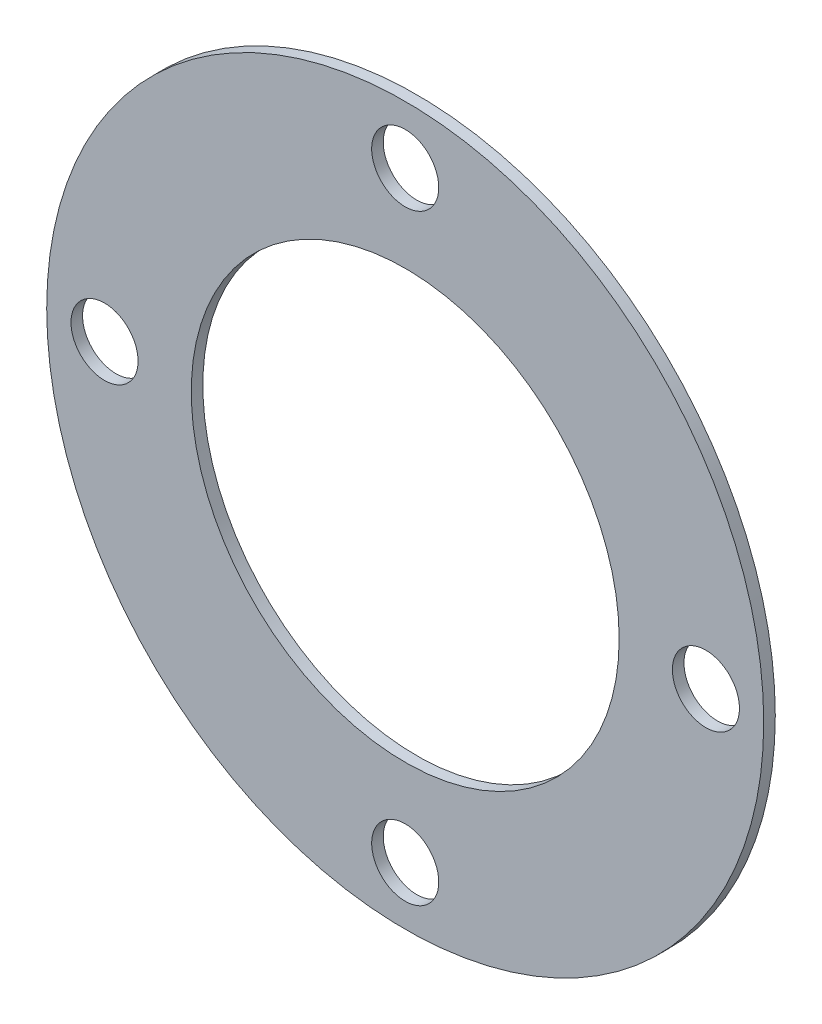
ISO-10303-21;
HEADER;
FILE_DESCRIPTION(('STEP AP214'),'2;1');
FILE_NAME('part.step','',(''),(''),'','','');
FILE_SCHEMA(('AUTOMOTIVE_DESIGN { 1 0 10303 214 1 1 1 1 }'));
ENDSEC;
DATA;
#1=APPLICATION_CONTEXT('core data for automotive mechanical design processes');
#2=APPLICATION_PROTOCOL_DEFINITION('international standard','automotive_design',2000,#1);
#3=PRODUCT_CONTEXT('',#1,'mechanical');
#4=PRODUCT('Part','Part','',(#3));
#5=PRODUCT_RELATED_PRODUCT_CATEGORY('part','',(#4));
#6=PRODUCT_DEFINITION_FORMATION('','',#4);
#7=PRODUCT_DEFINITION_CONTEXT('part definition',#1,'design');
#8=PRODUCT_DEFINITION('design','',#6,#7);
#9=PRODUCT_DEFINITION_SHAPE('','',#8);
#10=(LENGTH_UNIT() NAMED_UNIT(*) SI_UNIT(.MILLI.,.METRE.));
#11=(NAMED_UNIT(*) PLANE_ANGLE_UNIT() SI_UNIT($,.RADIAN.));
#12=(NAMED_UNIT(*) SI_UNIT($,.STERADIAN.) SOLID_ANGLE_UNIT());
#13=UNCERTAINTY_MEASURE_WITH_UNIT(LENGTH_MEASURE(1.E-05),#10,'distance_accuracy_value','');
#14=(GEOMETRIC_REPRESENTATION_CONTEXT(3) GLOBAL_UNCERTAINTY_ASSIGNED_CONTEXT((#13)) GLOBAL_UNIT_ASSIGNED_CONTEXT((#10,
#11,#12)) REPRESENTATION_CONTEXT('',''));
#15=CARTESIAN_POINT('',(0.,0.,0.));
#16=DIRECTION('',(0.,0.,1.));
#17=DIRECTION('',(1.,0.,0.));
#18=AXIS2_PLACEMENT_3D('',#15,#16,#17);
#19=CARTESIAN_POINT('',(0.,0.,1.));
#20=DIRECTION('',(0.,0.,1.));
#21=DIRECTION('',(1.,0.,0.));
#22=AXIS2_PLACEMENT_3D('',#19,#20,#21);
#23=PLANE('',#22);
#24=CARTESIAN_POINT('',(25.9999999999934,-3.34594061543591E-12,1.));
#25=DIRECTION('',(0.,0.,1.));
#26=DIRECTION('',(1.,0.,0.));
#27=AXIS2_PLACEMENT_3D('',#24,#25,#26);
#28=CIRCLE('',#27,2.9);
#29=CARTESIAN_POINT('',(28.8999999999934,-3.34594061543591E-12,1.));
#30=VERTEX_POINT('',#29);
#31=EDGE_CURVE('E73',#30,#30,#28,.T.);
#32=ORIENTED_EDGE('',*,*,#31,.F.);
#33=EDGE_LOOP('',(#32));
#34=FACE_BOUND('',#33,.T.);
#35=CARTESIAN_POINT('',(-3.36339689558326E-12,25.9999999999995,1.));
#36=DIRECTION('',(0.,0.,1.));
#37=DIRECTION('',(1.,0.,0.));
#38=AXIS2_PLACEMENT_3D('',#35,#36,#37);
#39=CIRCLE('',#38,2.9);
#40=CARTESIAN_POINT('',(2.89999999999664,25.9999999999995,1.));
#41=VERTEX_POINT('',#40);
#42=EDGE_CURVE('E67',#41,#41,#39,.T.);
#43=ORIENTED_EDGE('',*,*,#42,.F.);
#44=EDGE_LOOP('',(#43));
#45=FACE_BOUND('',#44,.T.);
#46=CARTESIAN_POINT('',(-26.0000000000063,2.49824977104097E-12,1.));
#47=DIRECTION('',(0.,0.,1.));
#48=DIRECTION('',(1.,0.,0.));
#49=AXIS2_PLACEMENT_3D('',#46,#47,#48);
#50=CIRCLE('',#49,2.9);
#51=CARTESIAN_POINT('',(-23.1000000000063,2.49824977104097E-12,1.));
#52=VERTEX_POINT('',#51);
#53=EDGE_CURVE('E61',#52,#52,#50,.T.);
#54=ORIENTED_EDGE('',*,*,#53,.F.);
#55=EDGE_LOOP('',(#54));
#56=FACE_BOUND('',#55,.T.);
#57=CARTESIAN_POINT('',(-9.57070134129982E-12,-26.0000000000002,1.));
#58=DIRECTION('',(0.,0.,1.));
#59=DIRECTION('',(1.,0.,0.));
#60=AXIS2_PLACEMENT_3D('',#57,#58,#59);
#61=CIRCLE('',#60,2.9);
#62=CARTESIAN_POINT('',(2.89999999999043,-26.0000000000002,1.));
#63=VERTEX_POINT('',#62);
#64=EDGE_CURVE('E55',#63,#63,#61,.T.);
#65=ORIENTED_EDGE('',*,*,#64,.F.);
#66=EDGE_LOOP('',(#65));
#67=FACE_BOUND('',#66,.T.);
#68=CARTESIAN_POINT('',(0.,0.,1.));
#69=DIRECTION('',(0.,0.,1.));
#70=DIRECTION('',(1.,0.,0.));
#71=AXIS2_PLACEMENT_3D('',#68,#69,#70);
#72=CIRCLE('',#71,31.);
#73=CARTESIAN_POINT('',(31.,0.,1.));
#74=VERTEX_POINT('',#73);
#75=EDGE_CURVE('E10',#74,#74,#72,.T.);
#76=ORIENTED_EDGE('',*,*,#75,.T.);
#77=EDGE_LOOP('',(#76));
#78=FACE_BOUND('',#77,.T.);
#79=CARTESIAN_POINT('',(0.,0.,1.));
#80=DIRECTION('',(0.,0.,1.));
#81=DIRECTION('',(1.,0.,0.));
#82=AXIS2_PLACEMENT_3D('',#79,#80,#81);
#83=CIRCLE('',#82,18.5);
#84=CARTESIAN_POINT('',(18.5,0.,1.));
#85=VERTEX_POINT('',#84);
#86=EDGE_CURVE('E45',#85,#85,#83,.T.);
#87=ORIENTED_EDGE('',*,*,#86,.F.);
#88=EDGE_LOOP('',(#87));
#89=FACE_BOUND('',#88,.T.);
#90=ADVANCED_FACE('F34',(#34,#45,#56,#67,#78,#89),#23,.T.);
#91=CARTESIAN_POINT('',(0.,0.,0.));
#92=DIRECTION('',(0.,0.,1.));
#93=DIRECTION('',(1.,0.,0.));
#94=AXIS2_PLACEMENT_3D('',#91,#92,#93);
#95=PLANE('',#94);
#96=CARTESIAN_POINT('',(25.9999999999934,-3.34594061543591E-12,0.));
#97=DIRECTION('',(0.,0.,1.));
#98=DIRECTION('',(1.,0.,0.));
#99=AXIS2_PLACEMENT_3D('',#96,#97,#98);
#100=CIRCLE('',#99,2.9);
#101=CARTESIAN_POINT('',(28.8999999999934,-3.34594061543591E-12,0.));
#102=VERTEX_POINT('',#101);
#103=EDGE_CURVE('E70',#102,#102,#100,.T.);
#104=ORIENTED_EDGE('',*,*,#103,.T.);
#105=EDGE_LOOP('',(#104));
#106=FACE_BOUND('',#105,.T.);
#107=CARTESIAN_POINT('',(-3.36339689558326E-12,25.9999999999995,0.));
#108=DIRECTION('',(0.,0.,1.));
#109=DIRECTION('',(1.,0.,0.));
#110=AXIS2_PLACEMENT_3D('',#107,#108,#109);
#111=CIRCLE('',#110,2.9);
#112=CARTESIAN_POINT('',(2.89999999999664,25.9999999999995,0.));
#113=VERTEX_POINT('',#112);
#114=EDGE_CURVE('E64',#113,#113,#111,.T.);
#115=ORIENTED_EDGE('',*,*,#114,.T.);
#116=EDGE_LOOP('',(#115));
#117=FACE_BOUND('',#116,.T.);
#118=CARTESIAN_POINT('',(-26.0000000000063,2.49824977104097E-12,0.));
#119=DIRECTION('',(0.,0.,1.));
#120=DIRECTION('',(1.,0.,0.));
#121=AXIS2_PLACEMENT_3D('',#118,#119,#120);
#122=CIRCLE('',#121,2.9);
#123=CARTESIAN_POINT('',(-23.1000000000063,2.49824977104097E-12,0.));
#124=VERTEX_POINT('',#123);
#125=EDGE_CURVE('E58',#124,#124,#122,.T.);
#126=ORIENTED_EDGE('',*,*,#125,.T.);
#127=EDGE_LOOP('',(#126));
#128=FACE_BOUND('',#127,.T.);
#129=CARTESIAN_POINT('',(-9.57070134129982E-12,-26.0000000000002,0.));
#130=DIRECTION('',(0.,0.,1.));
#131=DIRECTION('',(1.,0.,0.));
#132=AXIS2_PLACEMENT_3D('',#129,#130,#131);
#133=CIRCLE('',#132,2.9);
#134=CARTESIAN_POINT('',(2.89999999999043,-26.0000000000002,0.));
#135=VERTEX_POINT('',#134);
#136=EDGE_CURVE('E50',#135,#135,#133,.T.);
#137=ORIENTED_EDGE('',*,*,#136,.T.);
#138=EDGE_LOOP('',(#137));
#139=FACE_BOUND('',#138,.T.);
#140=CARTESIAN_POINT('',(0.,0.,0.));
#141=DIRECTION('',(0.,0.,1.));
#142=DIRECTION('',(1.,0.,0.));
#143=AXIS2_PLACEMENT_3D('',#140,#141,#142);
#144=CIRCLE('',#143,31.);
#145=CARTESIAN_POINT('',(31.,0.,0.));
#146=VERTEX_POINT('',#145);
#147=EDGE_CURVE('E38',#146,#146,#144,.T.);
#148=ORIENTED_EDGE('',*,*,#147,.F.);
#149=EDGE_LOOP('',(#148));
#150=FACE_BOUND('',#149,.T.);
#151=CARTESIAN_POINT('',(0.,0.,0.));
#152=DIRECTION('',(0.,0.,1.));
#153=DIRECTION('',(1.,0.,0.));
#154=AXIS2_PLACEMENT_3D('',#151,#152,#153);
#155=CIRCLE('',#154,18.5);
#156=CARTESIAN_POINT('',(18.5,0.,0.));
#157=VERTEX_POINT('',#156);
#158=EDGE_CURVE('E47',#157,#157,#155,.T.);
#159=ORIENTED_EDGE('',*,*,#158,.T.);
#160=EDGE_LOOP('',(#159));
#161=FACE_BOUND('',#160,.T.);
#162=ADVANCED_FACE('F81',(#106,#117,#128,#139,#150,#161),#95,.F.);
#163=CARTESIAN_POINT('',(0.,0.,1.));
#164=DIRECTION('',(0.,0.,-1.));
#165=DIRECTION('',(-1.,0.,0.));
#166=AXIS2_PLACEMENT_3D('',#163,#164,#165);
#167=CYLINDRICAL_SURFACE('',#166,31.);
#168=ORIENTED_EDGE('',*,*,#75,.F.);
#169=EDGE_LOOP('',(#168));
#170=FACE_BOUND('',#169,.T.);
#171=ORIENTED_EDGE('',*,*,#147,.T.);
#172=EDGE_LOOP('',(#171));
#173=FACE_BOUND('',#172,.T.);
#174=ADVANCED_FACE('F36',(#170,#173),#167,.T.);
#175=CARTESIAN_POINT('',(0.,0.,1.));
#176=DIRECTION('',(0.,0.,-1.));
#177=DIRECTION('',(-1.,0.,0.));
#178=AXIS2_PLACEMENT_3D('',#175,#176,#177);
#179=CYLINDRICAL_SURFACE('',#178,18.5);
#180=ORIENTED_EDGE('',*,*,#86,.T.);
#181=EDGE_LOOP('',(#180));
#182=FACE_BOUND('',#181,.T.);
#183=ORIENTED_EDGE('',*,*,#158,.F.);
#184=EDGE_LOOP('',(#183));
#185=FACE_BOUND('',#184,.T.);
#186=ADVANCED_FACE('F91',(#182,#185),#179,.F.);
#187=CARTESIAN_POINT('',(-9.57070134129982E-12,-26.0000000000002,1.));
#188=DIRECTION('',(0.,0.,1.));
#189=DIRECTION('',(1.,0.,0.));
#190=AXIS2_PLACEMENT_3D('',#187,#188,#189);
#191=CYLINDRICAL_SURFACE('',#190,2.9);
#192=ORIENTED_EDGE('',*,*,#136,.F.);
#193=EDGE_LOOP('',(#192));
#194=FACE_BOUND('',#193,.T.);
#195=ORIENTED_EDGE('',*,*,#64,.T.);
#196=EDGE_LOOP('',(#195));
#197=FACE_BOUND('',#196,.T.);
#198=ADVANCED_FACE('F94',(#194,#197),#191,.F.);
#199=CARTESIAN_POINT('',(-26.0000000000063,2.49824977104097E-12,1.));
#200=DIRECTION('',(0.,0.,1.));
#201=DIRECTION('',(1.,0.,0.));
#202=AXIS2_PLACEMENT_3D('',#199,#200,#201);
#203=CYLINDRICAL_SURFACE('',#202,2.9);
#204=ORIENTED_EDGE('',*,*,#125,.F.);
#205=EDGE_LOOP('',(#204));
#206=FACE_BOUND('',#205,.T.);
#207=ORIENTED_EDGE('',*,*,#53,.T.);
#208=EDGE_LOOP('',(#207));
#209=FACE_BOUND('',#208,.T.);
#210=ADVANCED_FACE('F108',(#206,#209),#203,.F.);
#211=CARTESIAN_POINT('',(-3.36339689558326E-12,25.9999999999995,1.));
#212=DIRECTION('',(0.,0.,1.));
#213=DIRECTION('',(1.,0.,0.));
#214=AXIS2_PLACEMENT_3D('',#211,#212,#213);
#215=CYLINDRICAL_SURFACE('',#214,2.9);
#216=ORIENTED_EDGE('',*,*,#114,.F.);
#217=EDGE_LOOP('',(#216));
#218=FACE_BOUND('',#217,.T.);
#219=ORIENTED_EDGE('',*,*,#42,.T.);
#220=EDGE_LOOP('',(#219));
#221=FACE_BOUND('',#220,.T.);
#222=ADVANCED_FACE('F112',(#218,#221),#215,.F.);
#223=CARTESIAN_POINT('',(25.9999999999934,-3.34594061543591E-12,1.));
#224=DIRECTION('',(0.,0.,1.));
#225=DIRECTION('',(1.,0.,0.));
#226=AXIS2_PLACEMENT_3D('',#223,#224,#225);
#227=CYLINDRICAL_SURFACE('',#226,2.9);
#228=ORIENTED_EDGE('',*,*,#103,.F.);
#229=EDGE_LOOP('',(#228));
#230=FACE_BOUND('',#229,.T.);
#231=ORIENTED_EDGE('',*,*,#31,.T.);
#232=EDGE_LOOP('',(#231));
#233=FACE_BOUND('',#232,.T.);
#234=ADVANCED_FACE('F77',(#230,#233),#227,.F.);
#235=CLOSED_SHELL('',(#90,#162,#174,#186,#198,#210,#222,#234));
#236=MANIFOLD_SOLID_BREP('B2',#235);
#237=ADVANCED_BREP_SHAPE_REPRESENTATION('',(#18,#236),#14);
#238=SHAPE_DEFINITION_REPRESENTATION(#9,#237);
ENDSEC;
END-ISO-10303-21;
